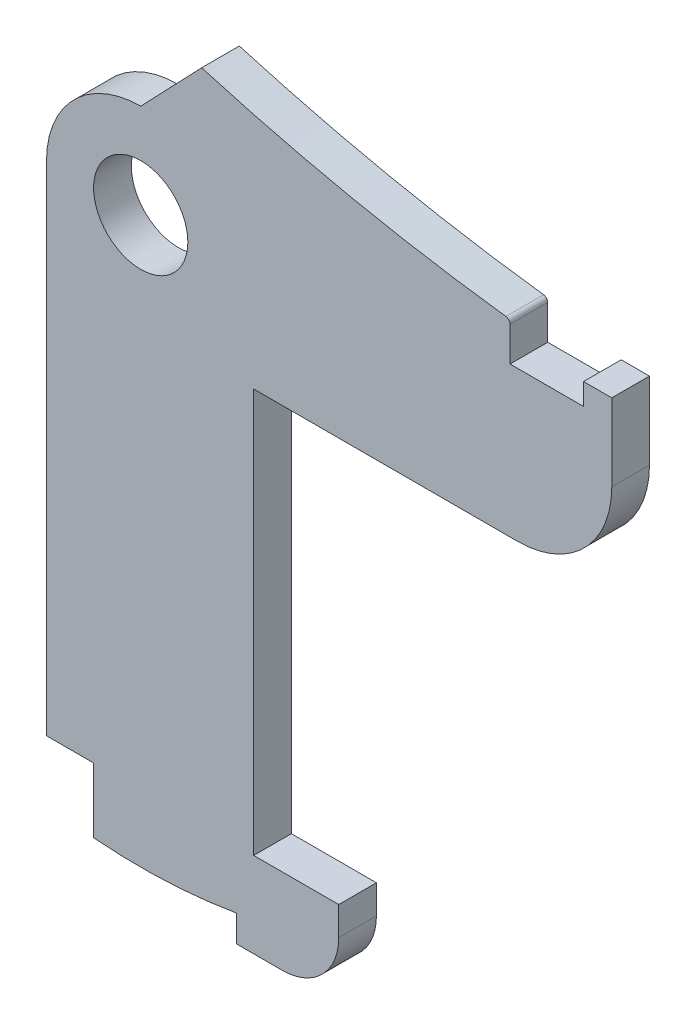
ISO-10303-21;
HEADER;
FILE_DESCRIPTION(('STEP AP214'),'2;1');
FILE_NAME('part.step','',(''),(''),'','','');
FILE_SCHEMA(('AUTOMOTIVE_DESIGN { 1 0 10303 214 1 1 1 1 }'));
ENDSEC;
DATA;
#1=APPLICATION_CONTEXT('core data for automotive mechanical design processes');
#2=APPLICATION_PROTOCOL_DEFINITION('international standard','automotive_design',2000,#1);
#3=PRODUCT_CONTEXT('',#1,'mechanical');
#4=PRODUCT('Part','Part','',(#3));
#5=PRODUCT_RELATED_PRODUCT_CATEGORY('part','',(#4));
#6=PRODUCT_DEFINITION_FORMATION('','',#4);
#7=PRODUCT_DEFINITION_CONTEXT('part definition',#1,'design');
#8=PRODUCT_DEFINITION('design','',#6,#7);
#9=PRODUCT_DEFINITION_SHAPE('','',#8);
#10=(LENGTH_UNIT() NAMED_UNIT(*) SI_UNIT(.MILLI.,.METRE.));
#11=(NAMED_UNIT(*) PLANE_ANGLE_UNIT() SI_UNIT($,.RADIAN.));
#12=(NAMED_UNIT(*) SI_UNIT($,.STERADIAN.) SOLID_ANGLE_UNIT());
#13=UNCERTAINTY_MEASURE_WITH_UNIT(LENGTH_MEASURE(1.E-05),#10,'distance_accuracy_value','');
#14=(GEOMETRIC_REPRESENTATION_CONTEXT(3) GLOBAL_UNCERTAINTY_ASSIGNED_CONTEXT((#13)) GLOBAL_UNIT_ASSIGNED_CONTEXT((#10,
#11,#12)) REPRESENTATION_CONTEXT('',''));
#15=CARTESIAN_POINT('',(0.,0.,0.));
#16=DIRECTION('',(0.,0.,1.));
#17=DIRECTION('',(1.,0.,0.));
#18=AXIS2_PLACEMENT_3D('',#15,#16,#17);
#19=CARTESIAN_POINT('',(37.6551533401373,-13.2873216735918,2.));
#20=DIRECTION('',(0.,0.,-1.));
#21=DIRECTION('',(-1.,0.,0.));
#22=AXIS2_PLACEMENT_3D('',#19,#20,#21);
#23=CYLINDRICAL_SURFACE('',#22,5.);
#24=CARTESIAN_POINT('',(37.6551533401373,-13.2873216735918,0.));
#25=DIRECTION('',(0.,0.,1.));
#26=DIRECTION('',(1.,0.,0.));
#27=AXIS2_PLACEMENT_3D('',#24,#25,#26);
#28=CIRCLE('',#27,5.);
#29=CARTESIAN_POINT('',(42.6551533401373,-13.2873216735918,0.));
#30=VERTEX_POINT('',#29);
#31=CARTESIAN_POINT('',(37.6551533401373,-18.2873216735918,0.));
#32=VERTEX_POINT('',#31);
#33=EDGE_CURVE('E209',#30,#32,#28,.F.);
#34=ORIENTED_EDGE('',*,*,#33,.F.);
#35=DIRECTION('',(0.,0.,-1.));
#36=VECTOR('',#35,1.);
#37=CARTESIAN_POINT('',(42.6551533401373,-13.2873216735918,2.));
#38=LINE('',#37,#36);
#39=CARTESIAN_POINT('',(42.6551533401373,-13.2873216735918,2.));
#40=VERTEX_POINT('',#39);
#41=EDGE_CURVE('E11',#40,#30,#38,.T.);
#42=ORIENTED_EDGE('',*,*,#41,.F.);
#43=CARTESIAN_POINT('',(37.6551533401373,-13.2873216735918,2.));
#44=DIRECTION('',(0.,0.,1.));
#45=DIRECTION('',(1.,0.,0.));
#46=AXIS2_PLACEMENT_3D('',#43,#44,#45);
#47=CIRCLE('',#46,5.);
#48=CARTESIAN_POINT('',(37.6551533401373,-18.2873216735918,2.));
#49=VERTEX_POINT('',#48);
#50=EDGE_CURVE('E266',#40,#49,#47,.F.);
#51=ORIENTED_EDGE('',*,*,#50,.T.);
#52=DIRECTION('',(0.,0.,-1.));
#53=VECTOR('',#52,1.);
#54=CARTESIAN_POINT('',(37.6551533401373,-18.2873216735918,2.));
#55=LINE('',#54,#53);
#56=EDGE_CURVE('E50',#49,#32,#55,.T.);
#57=ORIENTED_EDGE('',*,*,#56,.T.);
#58=EDGE_LOOP('',(#34,#42,#51,#57));
#59=FACE_BOUND('',#58,.T.);
#60=ADVANCED_FACE('F34',(#59),#23,.T.);
#61=CARTESIAN_POINT('',(42.6551533401373,0.,2.));
#62=DIRECTION('',(1.,0.,0.));
#63=DIRECTION('',(0.,0.,-1.));
#64=AXIS2_PLACEMENT_3D('',#61,#62,#63);
#65=PLANE('',#64);
#66=DIRECTION('',(0.,-1.,0.));
#67=VECTOR('',#66,1.);
#68=CARTESIAN_POINT('',(42.6551533401373,0.,0.));
#69=LINE('',#68,#67);
#70=CARTESIAN_POINT('',(42.6551533401373,-9.19140508374461,0.));
#71=VERTEX_POINT('',#70);
#72=EDGE_CURVE('E211',#71,#30,#69,.T.);
#73=ORIENTED_EDGE('',*,*,#72,.F.);
#74=DIRECTION('',(0.,0.,-1.));
#75=VECTOR('',#74,1.);
#76=CARTESIAN_POINT('',(42.6551533401373,-9.19140508374461,2.));
#77=LINE('',#76,#75);
#78=CARTESIAN_POINT('',(42.6551533401373,-9.19140508374461,2.));
#79=VERTEX_POINT('',#78);
#80=EDGE_CURVE('E42',#79,#71,#77,.T.);
#81=ORIENTED_EDGE('',*,*,#80,.F.);
#82=DIRECTION('',(0.,-1.,0.));
#83=VECTOR('',#82,1.);
#84=CARTESIAN_POINT('',(42.6551533401373,0.,2.));
#85=LINE('',#84,#83);
#86=EDGE_CURVE('E326',#79,#40,#85,.T.);
#87=ORIENTED_EDGE('',*,*,#86,.T.);
#88=ORIENTED_EDGE('',*,*,#41,.T.);
#89=EDGE_LOOP('',(#73,#81,#87,#88));
#90=FACE_BOUND('',#89,.T.);
#91=ADVANCED_FACE('F313',(#90),#65,.T.);
#92=CARTESIAN_POINT('',(0.,-9.19140508374461,2.));
#93=DIRECTION('',(0.,1.,0.));
#94=DIRECTION('',(0.,0.,1.));
#95=AXIS2_PLACEMENT_3D('',#92,#93,#94);
#96=PLANE('',#95);
#97=DIRECTION('',(1.,0.,0.));
#98=VECTOR('',#97,1.);
#99=CARTESIAN_POINT('',(0.,-9.19140508374461,0.));
#100=LINE('',#99,#98);
#101=CARTESIAN_POINT('',(41.1551533401373,-9.19140508374461,0.));
#102=VERTEX_POINT('',#101);
#103=EDGE_CURVE('E214',#102,#71,#100,.T.);
#104=ORIENTED_EDGE('',*,*,#103,.F.);
#105=DIRECTION('',(0.,0.,-1.));
#106=VECTOR('',#105,1.);
#107=CARTESIAN_POINT('',(41.1551533401373,-9.19140508374461,2.));
#108=LINE('',#107,#106);
#109=CARTESIAN_POINT('',(41.1551533401373,-9.19140508374461,2.));
#110=VERTEX_POINT('',#109);
#111=EDGE_CURVE('E302',#110,#102,#108,.T.);
#112=ORIENTED_EDGE('',*,*,#111,.F.);
#113=DIRECTION('',(1.,0.,0.));
#114=VECTOR('',#113,1.);
#115=CARTESIAN_POINT('',(0.,-9.19140508374461,2.));
#116=LINE('',#115,#114);
#117=EDGE_CURVE('E309',#110,#79,#116,.T.);
#118=ORIENTED_EDGE('',*,*,#117,.T.);
#119=ORIENTED_EDGE('',*,*,#80,.T.);
#120=EDGE_LOOP('',(#104,#112,#118,#119));
#121=FACE_BOUND('',#120,.T.);
#122=ADVANCED_FACE('F307',(#121),#96,.T.);
#123=CARTESIAN_POINT('',(41.1551533401373,0.,2.));
#124=DIRECTION('',(-1.,0.,0.));
#125=DIRECTION('',(0.,0.,1.));
#126=AXIS2_PLACEMENT_3D('',#123,#124,#125);
#127=PLANE('',#126);
#128=DIRECTION('',(0.,1.,0.));
#129=VECTOR('',#128,1.);
#130=CARTESIAN_POINT('',(41.1551533401373,0.,0.));
#131=LINE('',#130,#129);
#132=CARTESIAN_POINT('',(41.1551533401373,-10.3365932084194,0.));
#133=VERTEX_POINT('',#132);
#134=EDGE_CURVE('E217',#133,#102,#131,.T.);
#135=ORIENTED_EDGE('',*,*,#134,.F.);
#136=DIRECTION('',(0.,0.,-1.));
#137=VECTOR('',#136,1.);
#138=CARTESIAN_POINT('',(41.1551533401373,-10.3365932084194,2.));
#139=LINE('',#138,#137);
#140=CARTESIAN_POINT('',(41.1551533401373,-10.3365932084194,2.));
#141=VERTEX_POINT('',#140);
#142=EDGE_CURVE('E300',#141,#133,#139,.T.);
#143=ORIENTED_EDGE('',*,*,#142,.F.);
#144=DIRECTION('',(0.,1.,0.));
#145=VECTOR('',#144,1.);
#146=CARTESIAN_POINT('',(41.1551533401373,0.,2.));
#147=LINE('',#146,#145);
#148=EDGE_CURVE('E323',#141,#110,#147,.T.);
#149=ORIENTED_EDGE('',*,*,#148,.T.);
#150=ORIENTED_EDGE('',*,*,#111,.T.);
#151=EDGE_LOOP('',(#135,#143,#149,#150));
#152=FACE_BOUND('',#151,.T.);
#153=ADVANCED_FACE('F320',(#152),#127,.T.);
#154=CARTESIAN_POINT('',(0.,-10.3365932084194,2.));
#155=DIRECTION('',(0.,1.,0.));
#156=DIRECTION('',(0.,0.,1.));
#157=AXIS2_PLACEMENT_3D('',#154,#155,#156);
#158=PLANE('',#157);
#159=DIRECTION('',(1.,0.,0.));
#160=VECTOR('',#159,1.);
#161=CARTESIAN_POINT('',(0.,-10.3365932084194,0.));
#162=LINE('',#161,#160);
#163=CARTESIAN_POINT('',(37.2551533401373,-10.3365932084194,0.));
#164=VERTEX_POINT('',#163);
#165=EDGE_CURVE('E220',#164,#133,#162,.T.);
#166=ORIENTED_EDGE('',*,*,#165,.F.);
#167=DIRECTION('',(0.,0.,-1.));
#168=VECTOR('',#167,1.);
#169=CARTESIAN_POINT('',(37.2551533401373,-10.3365932084194,2.));
#170=LINE('',#169,#168);
#171=CARTESIAN_POINT('',(37.2551533401373,-10.3365932084194,2.));
#172=VERTEX_POINT('',#171);
#173=EDGE_CURVE('E298',#172,#164,#170,.T.);
#174=ORIENTED_EDGE('',*,*,#173,.F.);
#175=DIRECTION('',(1.,0.,0.));
#176=VECTOR('',#175,1.);
#177=CARTESIAN_POINT('',(0.,-10.3365932084194,2.));
#178=LINE('',#177,#176);
#179=EDGE_CURVE('E328',#172,#141,#178,.T.);
#180=ORIENTED_EDGE('',*,*,#179,.T.);
#181=ORIENTED_EDGE('',*,*,#142,.T.);
#182=EDGE_LOOP('',(#166,#174,#180,#181));
#183=FACE_BOUND('',#182,.T.);
#184=ADVANCED_FACE('F395',(#183),#158,.T.);
#185=CARTESIAN_POINT('',(37.2551533401373,0.,2.));
#186=DIRECTION('',(1.,0.,0.));
#187=DIRECTION('',(0.,0.,-1.));
#188=AXIS2_PLACEMENT_3D('',#185,#186,#187);
#189=PLANE('',#188);
#190=DIRECTION('',(0.,-1.,0.));
#191=VECTOR('',#190,1.);
#192=CARTESIAN_POINT('',(37.2551533401373,0.,0.));
#193=LINE('',#192,#191);
#194=CARTESIAN_POINT('',(37.2551533401373,-8.50812600454305,0.));
#195=VERTEX_POINT('',#194);
#196=EDGE_CURVE('E223',#195,#164,#193,.T.);
#197=ORIENTED_EDGE('',*,*,#196,.F.);
#198=DIRECTION('',(0.,0.,-1.));
#199=VECTOR('',#198,1.);
#200=CARTESIAN_POINT('',(37.2551533401373,-8.50812600454305,2.));
#201=LINE('',#200,#199);
#202=CARTESIAN_POINT('',(37.2551533401373,-8.50812600454305,2.));
#203=VERTEX_POINT('',#202);
#204=EDGE_CURVE('E296',#203,#195,#201,.T.);
#205=ORIENTED_EDGE('',*,*,#204,.F.);
#206=DIRECTION('',(0.,-1.,0.));
#207=VECTOR('',#206,1.);
#208=CARTESIAN_POINT('',(37.2551533401373,0.,2.));
#209=LINE('',#208,#207);
#210=EDGE_CURVE('E334',#203,#172,#209,.T.);
#211=ORIENTED_EDGE('',*,*,#210,.T.);
#212=ORIENTED_EDGE('',*,*,#173,.T.);
#213=EDGE_LOOP('',(#197,#205,#211,#212));
#214=FACE_BOUND('',#213,.T.);
#215=ADVANCED_FACE('F398',(#214),#189,.T.);
#216=CARTESIAN_POINT('',(37.0051533401373,-8.50812600454305,2.));
#217=DIRECTION('',(0.,0.,-1.));
#218=DIRECTION('',(-1.,0.,0.));
#219=AXIS2_PLACEMENT_3D('',#216,#217,#218);
#220=CYLINDRICAL_SURFACE('',#219,0.250000000000006);
#221=CARTESIAN_POINT('',(37.0051533401373,-8.50812600454305,0.));
#222=DIRECTION('',(0.,0.,1.));
#223=DIRECTION('',(1.,0.,0.));
#224=AXIS2_PLACEMENT_3D('',#221,#222,#223);
#225=CIRCLE('',#224,0.250000000000006);
#226=CARTESIAN_POINT('',(37.0363055040114,-8.26007451253793,0.));
#227=VERTEX_POINT('',#226);
#228=EDGE_CURVE('E226',#227,#195,#225,.F.);
#229=ORIENTED_EDGE('',*,*,#228,.F.);
#230=DIRECTION('',(0.,0.,-1.));
#231=VECTOR('',#230,1.);
#232=CARTESIAN_POINT('',(37.0363055040114,-8.26007451253793,2.));
#233=LINE('',#232,#231);
#234=CARTESIAN_POINT('',(37.0363055040114,-8.26007451253793,2.));
#235=VERTEX_POINT('',#234);
#236=EDGE_CURVE('E294',#235,#227,#233,.T.);
#237=ORIENTED_EDGE('',*,*,#236,.F.);
#238=CARTESIAN_POINT('',(37.0051533401373,-8.50812600454305,2.));
#239=DIRECTION('',(0.,0.,1.));
#240=DIRECTION('',(1.,0.,0.));
#241=AXIS2_PLACEMENT_3D('',#238,#239,#240);
#242=CIRCLE('',#241,0.250000000000006);
#243=EDGE_CURVE('E337',#235,#203,#242,.F.);
#244=ORIENTED_EDGE('',*,*,#243,.T.);
#245=ORIENTED_EDGE('',*,*,#204,.T.);
#246=EDGE_LOOP('',(#229,#237,#244,#245));
#247=FACE_BOUND('',#246,.T.);
#248=ADVANCED_FACE('F402',(#247),#220,.T.);
#249=CARTESIAN_POINT('',(49.9016252193587,94.1810195769606,2.));
#250=DIRECTION('',(0.,0.,-1.));
#251=DIRECTION('',(-1.,0.,0.));
#252=AXIS2_PLACEMENT_3D('',#249,#250,#251);
#253=CYLINDRICAL_SURFACE('',#252,103.245795118405);
#254=CARTESIAN_POINT('',(49.9016252193587,94.1810195769606,0.));
#255=DIRECTION('',(0.,0.,1.));
#256=DIRECTION('',(1.,0.,0.));
#257=AXIS2_PLACEMENT_3D('',#254,#255,#256);
#258=CIRCLE('',#257,103.245795118405);
#259=CARTESIAN_POINT('',(20.8870655256356,-4.90404254347698,0.));
#260=VERTEX_POINT('',#259);
#261=EDGE_CURVE('E229',#227,#260,#258,.F.);
#262=ORIENTED_EDGE('',*,*,#261,.T.);
#263=DIRECTION('',(0.,0.,-1.));
#264=VECTOR('',#263,1.);
#265=CARTESIAN_POINT('',(20.8870655256356,-4.90404254347698,2.));
#266=LINE('',#265,#264);
#267=CARTESIAN_POINT('',(20.8870655256356,-4.90404254347698,2.));
#268=VERTEX_POINT('',#267);
#269=EDGE_CURVE('E292',#268,#260,#266,.T.);
#270=ORIENTED_EDGE('',*,*,#269,.F.);
#271=CARTESIAN_POINT('',(49.9016252193587,94.1810195769606,2.));
#272=DIRECTION('',(0.,0.,1.));
#273=DIRECTION('',(1.,0.,0.));
#274=AXIS2_PLACEMENT_3D('',#271,#272,#273);
#275=CIRCLE('',#274,103.245795118405);
#276=EDGE_CURVE('E340',#235,#268,#275,.F.);
#277=ORIENTED_EDGE('',*,*,#276,.F.);
#278=ORIENTED_EDGE('',*,*,#236,.T.);
#279=EDGE_LOOP('',(#262,#270,#277,#278));
#280=FACE_BOUND('',#279,.T.);
#281=ADVANCED_FACE('F406',(#280),#253,.F.);
#282=CARTESIAN_POINT('',(13.3706696032515,-12.772469653591,2.));
#283=DIRECTION('',(-0.723097327047915,0.690746158596746,0.));
#284=DIRECTION('',(-0.690746158596746,-0.723097327047915,0.));
#285=AXIS2_PLACEMENT_3D('',#282,#283,#284);
#286=PLANE('',#285);
#287=DIRECTION('',(0.690746158596746,0.723097327047915,0.));
#288=VECTOR('',#287,1.);
#289=CARTESIAN_POINT('',(13.3706696032515,-12.772469653591,0.));
#290=LINE('',#289,#288);
#291=CARTESIAN_POINT('',(17.6551533401373,-8.2873216735918,0.));
#292=VERTEX_POINT('',#291);
#293=EDGE_CURVE('E232',#292,#260,#290,.T.);
#294=ORIENTED_EDGE('',*,*,#293,.F.);
#295=DIRECTION('',(0.,0.,-1.));
#296=VECTOR('',#295,1.);
#297=CARTESIAN_POINT('',(17.6551533401373,-8.2873216735918,2.));
#298=LINE('',#297,#296);
#299=CARTESIAN_POINT('',(17.6551533401373,-8.2873216735918,2.));
#300=VERTEX_POINT('',#299);
#301=EDGE_CURVE('E290',#300,#292,#298,.T.);
#302=ORIENTED_EDGE('',*,*,#301,.F.);
#303=DIRECTION('',(0.690746158596746,0.723097327047915,0.));
#304=VECTOR('',#303,1.);
#305=CARTESIAN_POINT('',(13.3706696032515,-12.772469653591,2.));
#306=LINE('',#305,#304);
#307=EDGE_CURVE('E342',#300,#268,#306,.T.);
#308=ORIENTED_EDGE('',*,*,#307,.T.);
#309=ORIENTED_EDGE('',*,*,#269,.T.);
#310=EDGE_LOOP('',(#294,#302,#308,#309));
#311=FACE_BOUND('',#310,.T.);
#312=ADVANCED_FACE('F410',(#311),#286,.T.);
#313=CARTESIAN_POINT('',(17.6551533401373,-13.2873216735918,2.));
#314=DIRECTION('',(0.,0.,-1.));
#315=DIRECTION('',(-1.,0.,0.));
#316=AXIS2_PLACEMENT_3D('',#313,#314,#315);
#317=CYLINDRICAL_SURFACE('',#316,5.);
#318=CARTESIAN_POINT('',(17.6551533401373,-13.2873216735918,0.));
#319=DIRECTION('',(0.,0.,1.));
#320=DIRECTION('',(1.,0.,0.));
#321=AXIS2_PLACEMENT_3D('',#318,#319,#320);
#322=CIRCLE('',#321,5.);
#323=CARTESIAN_POINT('',(12.6551533401373,-13.2873216735918,0.));
#324=VERTEX_POINT('',#323);
#325=EDGE_CURVE('E235',#292,#324,#322,.T.);
#326=ORIENTED_EDGE('',*,*,#325,.T.);
#327=DIRECTION('',(0.,0.,-1.));
#328=VECTOR('',#327,1.);
#329=CARTESIAN_POINT('',(12.6551533401373,-13.2873216735918,2.));
#330=LINE('',#329,#328);
#331=CARTESIAN_POINT('',(12.6551533401373,-13.2873216735918,2.));
#332=VERTEX_POINT('',#331);
#333=EDGE_CURVE('E288',#332,#324,#330,.T.);
#334=ORIENTED_EDGE('',*,*,#333,.F.);
#335=CARTESIAN_POINT('',(17.6551533401373,-13.2873216735918,2.));
#336=DIRECTION('',(0.,0.,1.));
#337=DIRECTION('',(1.,0.,0.));
#338=AXIS2_PLACEMENT_3D('',#335,#336,#337);
#339=CIRCLE('',#338,5.);
#340=EDGE_CURVE('E345',#300,#332,#339,.T.);
#341=ORIENTED_EDGE('',*,*,#340,.F.);
#342=ORIENTED_EDGE('',*,*,#301,.T.);
#343=EDGE_LOOP('',(#326,#334,#341,#342));
#344=FACE_BOUND('',#343,.T.);
#345=ADVANCED_FACE('F414',(#344),#317,.T.);
#346=CARTESIAN_POINT('',(12.6551533401373,0.,2.));
#347=DIRECTION('',(-1.,0.,0.));
#348=DIRECTION('',(0.,-1.,0.));
#349=AXIS2_PLACEMENT_3D('',#346,#347,#348);
#350=PLANE('',#349);
#351=DIRECTION('',(0.,1.,0.));
#352=VECTOR('',#351,1.);
#353=CARTESIAN_POINT('',(12.6551533401373,0.,0.));
#354=LINE('',#353,#352);
#355=CARTESIAN_POINT('',(12.6551533401373,-39.7249994987501,0.));
#356=VERTEX_POINT('',#355);
#357=EDGE_CURVE('E238',#356,#324,#354,.T.);
#358=ORIENTED_EDGE('',*,*,#357,.F.);
#359=DIRECTION('',(0.,0.,-1.));
#360=VECTOR('',#359,1.);
#361=CARTESIAN_POINT('',(12.6551533401373,-39.7249994987501,2.));
#362=LINE('',#361,#360);
#363=CARTESIAN_POINT('',(12.6551533401373,-39.7249994987501,2.));
#364=VERTEX_POINT('',#363);
#365=EDGE_CURVE('E286',#364,#356,#362,.T.);
#366=ORIENTED_EDGE('',*,*,#365,.F.);
#367=DIRECTION('',(0.,1.,0.));
#368=VECTOR('',#367,1.);
#369=CARTESIAN_POINT('',(12.6551533401373,0.,2.));
#370=LINE('',#369,#368);
#371=EDGE_CURVE('E347',#364,#332,#370,.T.);
#372=ORIENTED_EDGE('',*,*,#371,.T.);
#373=ORIENTED_EDGE('',*,*,#333,.T.);
#374=EDGE_LOOP('',(#358,#366,#372,#373));
#375=FACE_BOUND('',#374,.T.);
#376=ADVANCED_FACE('F418',(#375),#350,.T.);
#377=CARTESIAN_POINT('',(0.,-39.7249994987501,2.));
#378=DIRECTION('',(0.,-1.,0.));
#379=DIRECTION('',(0.,0.,-1.));
#380=AXIS2_PLACEMENT_3D('',#377,#378,#379);
#381=PLANE('',#380);
#382=DIRECTION('',(-1.,0.,0.));
#383=VECTOR('',#382,1.);
#384=CARTESIAN_POINT('',(0.,-39.7249994987501,0.));
#385=LINE('',#384,#383);
#386=CARTESIAN_POINT('',(15.1551533401373,-39.7249994987501,0.));
#387=VERTEX_POINT('',#386);
#388=EDGE_CURVE('E241',#387,#356,#385,.T.);
#389=ORIENTED_EDGE('',*,*,#388,.F.);
#390=DIRECTION('',(0.,0.,-1.));
#391=VECTOR('',#390,1.);
#392=CARTESIAN_POINT('',(15.1551533401373,-39.7249994987501,2.));
#393=LINE('',#392,#391);
#394=CARTESIAN_POINT('',(15.1551533401373,-39.7249994987501,2.));
#395=VERTEX_POINT('',#394);
#396=EDGE_CURVE('E284',#395,#387,#393,.T.);
#397=ORIENTED_EDGE('',*,*,#396,.F.);
#398=DIRECTION('',(-1.,0.,0.));
#399=VECTOR('',#398,1.);
#400=CARTESIAN_POINT('',(0.,-39.7249994987501,2.));
#401=LINE('',#400,#399);
#402=EDGE_CURVE('E350',#395,#364,#401,.T.);
#403=ORIENTED_EDGE('',*,*,#402,.T.);
#404=ORIENTED_EDGE('',*,*,#365,.T.);
#405=EDGE_LOOP('',(#389,#397,#403,#404));
#406=FACE_BOUND('',#405,.T.);
#407=ADVANCED_FACE('F422',(#406),#381,.T.);
#408=CARTESIAN_POINT('',(15.1551533401373,0.,2.));
#409=DIRECTION('',(-1.,0.,0.));
#410=DIRECTION('',(0.,0.,1.));
#411=AXIS2_PLACEMENT_3D('',#408,#409,#410);
#412=PLANE('',#411);
#413=DIRECTION('',(0.,1.,0.));
#414=VECTOR('',#413,1.);
#415=CARTESIAN_POINT('',(15.1551533401373,0.,0.));
#416=LINE('',#415,#414);
#417=CARTESIAN_POINT('',(15.1551533401373,-43.1617960065011,0.));
#418=VERTEX_POINT('',#417);
#419=EDGE_CURVE('E244',#418,#387,#416,.T.);
#420=ORIENTED_EDGE('',*,*,#419,.F.);
#421=DIRECTION('',(0.,0.,-1.));
#422=VECTOR('',#421,1.);
#423=CARTESIAN_POINT('',(15.1551533401373,-43.1617960065011,2.));
#424=LINE('',#423,#422);
#425=CARTESIAN_POINT('',(15.1551533401373,-43.1617960065011,2.));
#426=VERTEX_POINT('',#425);
#427=EDGE_CURVE('E282',#426,#418,#424,.T.);
#428=ORIENTED_EDGE('',*,*,#427,.F.);
#429=DIRECTION('',(0.,1.,0.));
#430=VECTOR('',#429,1.);
#431=CARTESIAN_POINT('',(15.1551533401373,0.,2.));
#432=LINE('',#431,#430);
#433=EDGE_CURVE('E353',#426,#395,#432,.T.);
#434=ORIENTED_EDGE('',*,*,#433,.T.);
#435=ORIENTED_EDGE('',*,*,#396,.T.);
#436=EDGE_LOOP('',(#420,#428,#434,#435));
#437=FACE_BOUND('',#436,.T.);
#438=ADVANCED_FACE('F426',(#437),#412,.T.);
#439=CARTESIAN_POINT('',(17.6551533401373,-13.2873216735918,2.));
#440=DIRECTION('',(0.,0.,-1.));
#441=DIRECTION('',(-1.,0.,0.));
#442=AXIS2_PLACEMENT_3D('',#439,#440,#441);
#443=CYLINDRICAL_SURFACE('',#442,29.9788961882798);
#444=CARTESIAN_POINT('',(17.6551533401373,-13.2873216735918,0.));
#445=DIRECTION('',(0.,0.,1.));
#446=DIRECTION('',(1.,0.,0.));
#447=AXIS2_PLACEMENT_3D('',#444,#445,#446);
#448=CIRCLE('',#447,29.9788961882798);
#449=CARTESIAN_POINT('',(22.731294665656,-42.8333367333425,0.));
#450=VERTEX_POINT('',#449);
#451=EDGE_CURVE('E247',#418,#450,#448,.T.);
#452=ORIENTED_EDGE('',*,*,#451,.T.);
#453=DIRECTION('',(0.,0.,-1.));
#454=VECTOR('',#453,1.);
#455=CARTESIAN_POINT('',(22.731294665656,-42.8333367333425,2.));
#456=LINE('',#455,#454);
#457=CARTESIAN_POINT('',(22.731294665656,-42.8333367333425,2.));
#458=VERTEX_POINT('',#457);
#459=EDGE_CURVE('E279',#458,#450,#456,.T.);
#460=ORIENTED_EDGE('',*,*,#459,.F.);
#461=CARTESIAN_POINT('',(17.6551533401373,-13.2873216735918,2.));
#462=DIRECTION('',(0.,0.,1.));
#463=DIRECTION('',(1.,0.,0.));
#464=AXIS2_PLACEMENT_3D('',#461,#462,#463);
#465=CIRCLE('',#464,29.9788961882798);
#466=EDGE_CURVE('E356',#426,#458,#465,.T.);
#467=ORIENTED_EDGE('',*,*,#466,.F.);
#468=ORIENTED_EDGE('',*,*,#427,.T.);
#469=EDGE_LOOP('',(#452,#460,#467,#468));
#470=FACE_BOUND('',#469,.T.);
#471=ADVANCED_FACE('F430',(#470),#443,.T.);
#472=CARTESIAN_POINT('',(22.731294665656,0.,2.));
#473=DIRECTION('',(1.,0.,0.));
#474=DIRECTION('',(0.,0.,-1.));
#475=AXIS2_PLACEMENT_3D('',#472,#473,#474);
#476=PLANE('',#475);
#477=DIRECTION('',(0.,-1.,0.));
#478=VECTOR('',#477,1.);
#479=CARTESIAN_POINT('',(22.731294665656,0.,0.));
#480=LINE('',#479,#478);
#481=CARTESIAN_POINT('',(22.731294665656,-44.2490790535218,0.));
#482=VERTEX_POINT('',#481);
#483=EDGE_CURVE('E249',#450,#482,#480,.T.);
#484=ORIENTED_EDGE('',*,*,#483,.T.);
#485=DIRECTION('',(0.,0.,-1.));
#486=VECTOR('',#485,1.);
#487=CARTESIAN_POINT('',(22.731294665656,-44.2490790535218,2.));
#488=LINE('',#487,#486);
#489=CARTESIAN_POINT('',(22.731294665656,-44.2490790535218,2.));
#490=VERTEX_POINT('',#489);
#491=EDGE_CURVE('E276',#490,#482,#488,.T.);
#492=ORIENTED_EDGE('',*,*,#491,.F.);
#493=DIRECTION('',(0.,-1.,0.));
#494=VECTOR('',#493,1.);
#495=CARTESIAN_POINT('',(22.731294665656,0.,2.));
#496=LINE('',#495,#494);
#497=EDGE_CURVE('E358',#458,#490,#496,.T.);
#498=ORIENTED_EDGE('',*,*,#497,.F.);
#499=ORIENTED_EDGE('',*,*,#459,.T.);
#500=EDGE_LOOP('',(#484,#492,#498,#499));
#501=FACE_BOUND('',#500,.T.);
#502=ADVANCED_FACE('F434',(#501),#476,.F.);
#503=CARTESIAN_POINT('',(0.,-44.2490790535218,2.));
#504=DIRECTION('',(0.,1.,0.));
#505=DIRECTION('',(0.,0.,1.));
#506=AXIS2_PLACEMENT_3D('',#503,#504,#505);
#507=PLANE('',#506);
#508=DIRECTION('',(1.,0.,0.));
#509=VECTOR('',#508,1.);
#510=CARTESIAN_POINT('',(0.,-44.2490790535218,0.));
#511=LINE('',#510,#509);
#512=CARTESIAN_POINT('',(25.1634057429237,-44.2490790535218,0.));
#513=VERTEX_POINT('',#512);
#514=EDGE_CURVE('E251',#482,#513,#511,.T.);
#515=ORIENTED_EDGE('',*,*,#514,.T.);
#516=DIRECTION('',(0.,0.,-1.));
#517=VECTOR('',#516,1.);
#518=CARTESIAN_POINT('',(25.1634057429237,-44.2490790535218,2.));
#519=LINE('',#518,#517);
#520=CARTESIAN_POINT('',(25.1634057429237,-44.2490790535218,2.));
#521=VERTEX_POINT('',#520);
#522=EDGE_CURVE('E273',#521,#513,#519,.T.);
#523=ORIENTED_EDGE('',*,*,#522,.F.);
#524=DIRECTION('',(1.,0.,0.));
#525=VECTOR('',#524,1.);
#526=CARTESIAN_POINT('',(0.,-44.2490790535218,2.));
#527=LINE('',#526,#525);
#528=EDGE_CURVE('E360',#490,#521,#527,.T.);
#529=ORIENTED_EDGE('',*,*,#528,.F.);
#530=ORIENTED_EDGE('',*,*,#491,.T.);
#531=EDGE_LOOP('',(#515,#523,#529,#530));
#532=FACE_BOUND('',#531,.T.);
#533=ADVANCED_FACE('F438',(#532),#507,.F.);
#534=CARTESIAN_POINT('',(25.1634057429237,-41.2490790535218,2.));
#535=DIRECTION('',(0.,0.,-1.));
#536=DIRECTION('',(-1.,0.,0.));
#537=AXIS2_PLACEMENT_3D('',#534,#535,#536);
#538=CYLINDRICAL_SURFACE('',#537,3.);
#539=CARTESIAN_POINT('',(25.1634057429237,-41.2490790535218,0.));
#540=DIRECTION('',(0.,0.,1.));
#541=DIRECTION('',(1.,0.,0.));
#542=AXIS2_PLACEMENT_3D('',#539,#540,#541);
#543=CIRCLE('',#542,3.);
#544=CARTESIAN_POINT('',(28.1634057429237,-41.2490790535218,0.));
#545=VERTEX_POINT('',#544);
#546=EDGE_CURVE('E253',#513,#545,#543,.T.);
#547=ORIENTED_EDGE('',*,*,#546,.T.);
#548=DIRECTION('',(0.,0.,-1.));
#549=VECTOR('',#548,1.);
#550=CARTESIAN_POINT('',(28.1634057429237,-41.2490790535218,2.));
#551=LINE('',#550,#549);
#552=CARTESIAN_POINT('',(28.1634057429237,-41.2490790535218,2.));
#553=VERTEX_POINT('',#552);
#554=EDGE_CURVE('E270',#553,#545,#551,.T.);
#555=ORIENTED_EDGE('',*,*,#554,.F.);
#556=CARTESIAN_POINT('',(25.1634057429237,-41.2490790535218,2.));
#557=DIRECTION('',(0.,0.,1.));
#558=DIRECTION('',(1.,0.,0.));
#559=AXIS2_PLACEMENT_3D('',#556,#557,#558);
#560=CIRCLE('',#559,3.);
#561=EDGE_CURVE('E362',#521,#553,#560,.T.);
#562=ORIENTED_EDGE('',*,*,#561,.F.);
#563=ORIENTED_EDGE('',*,*,#522,.T.);
#564=EDGE_LOOP('',(#547,#555,#562,#563));
#565=FACE_BOUND('',#564,.T.);
#566=ADVANCED_FACE('F368',(#565),#538,.T.);
#567=CARTESIAN_POINT('',(28.1634057429237,0.,2.));
#568=DIRECTION('',(-1.,0.,0.));
#569=DIRECTION('',(0.,0.,1.));
#570=AXIS2_PLACEMENT_3D('',#567,#568,#569);
#571=PLANE('',#570);
#572=DIRECTION('',(0.,1.,0.));
#573=VECTOR('',#572,1.);
#574=CARTESIAN_POINT('',(28.1634057429237,0.,0.));
#575=LINE('',#574,#573);
#576=CARTESIAN_POINT('',(28.1634057429237,-39.7249994987501,0.));
#577=VERTEX_POINT('',#576);
#578=EDGE_CURVE('E255',#545,#577,#575,.T.);
#579=ORIENTED_EDGE('',*,*,#578,.T.);
#580=DIRECTION('',(0.,0.,-1.));
#581=VECTOR('',#580,1.);
#582=CARTESIAN_POINT('',(28.1634057429237,-39.7249994987501,2.));
#583=LINE('',#582,#581);
#584=CARTESIAN_POINT('',(28.1634057429237,-39.7249994987501,2.));
#585=VERTEX_POINT('',#584);
#586=EDGE_CURVE('E198',#585,#577,#583,.T.);
#587=ORIENTED_EDGE('',*,*,#586,.F.);
#588=DIRECTION('',(0.,1.,0.));
#589=VECTOR('',#588,1.);
#590=CARTESIAN_POINT('',(28.1634057429237,0.,2.));
#591=LINE('',#590,#589);
#592=EDGE_CURVE('E186',#553,#585,#591,.T.);
#593=ORIENTED_EDGE('',*,*,#592,.F.);
#594=ORIENTED_EDGE('',*,*,#554,.T.);
#595=EDGE_LOOP('',(#579,#587,#593,#594));
#596=FACE_BOUND('',#595,.T.);
#597=ADVANCED_FACE('F372',(#596),#571,.F.);
#598=CARTESIAN_POINT('',(0.,-39.7249994987501,2.));
#599=DIRECTION('',(0.,-1.,0.));
#600=DIRECTION('',(0.,0.,-1.));
#601=AXIS2_PLACEMENT_3D('',#598,#599,#600);
#602=PLANE('',#601);
#603=DIRECTION('',(-1.,0.,0.));
#604=VECTOR('',#603,1.);
#605=CARTESIAN_POINT('',(0.,-39.7249994987501,0.));
#606=LINE('',#605,#604);
#607=CARTESIAN_POINT('',(23.6500222638875,-39.7249994987501,0.));
#608=VERTEX_POINT('',#607);
#609=EDGE_CURVE('E195',#577,#608,#606,.T.);
#610=ORIENTED_EDGE('',*,*,#609,.T.);
#611=DIRECTION('',(0.,0.,-1.));
#612=VECTOR('',#611,1.);
#613=CARTESIAN_POINT('',(23.6500222638875,-39.7249994987501,2.));
#614=LINE('',#613,#612);
#615=CARTESIAN_POINT('',(23.6500222638875,-39.7249994987501,2.));
#616=VERTEX_POINT('',#615);
#617=EDGE_CURVE('E192',#616,#608,#614,.T.);
#618=ORIENTED_EDGE('',*,*,#617,.F.);
#619=DIRECTION('',(-1.,0.,0.));
#620=VECTOR('',#619,1.);
#621=CARTESIAN_POINT('',(0.,-39.7249994987501,2.));
#622=LINE('',#621,#620);
#623=EDGE_CURVE('E178',#585,#616,#622,.T.);
#624=ORIENTED_EDGE('',*,*,#623,.F.);
#625=ORIENTED_EDGE('',*,*,#586,.T.);
#626=EDGE_LOOP('',(#610,#618,#624,#625));
#627=FACE_BOUND('',#626,.T.);
#628=ADVANCED_FACE('F193',(#627),#602,.F.);
#629=CARTESIAN_POINT('',(23.6500222638874,0.,2.));
#630=DIRECTION('',(1.,0.,0.));
#631=DIRECTION('',(0.,1.,0.));
#632=AXIS2_PLACEMENT_3D('',#629,#630,#631);
#633=PLANE('',#632);
#634=DIRECTION('',(0.,-1.,0.));
#635=VECTOR('',#634,1.);
#636=CARTESIAN_POINT('',(23.6500222638874,0.,0.));
#637=LINE('',#636,#635);
#638=CARTESIAN_POINT('',(23.6500222638875,-18.2873216735918,0.));
#639=VERTEX_POINT('',#638);
#640=EDGE_CURVE('E258',#639,#608,#637,.T.);
#641=ORIENTED_EDGE('',*,*,#640,.F.);
#642=DIRECTION('',(0.,0.,-1.));
#643=VECTOR('',#642,1.);
#644=CARTESIAN_POINT('',(23.6500222638875,-18.2873216735918,2.));
#645=LINE('',#644,#643);
#646=CARTESIAN_POINT('',(23.6500222638875,-18.2873216735918,2.));
#647=VERTEX_POINT('',#646);
#648=EDGE_CURVE('E114',#647,#639,#645,.T.);
#649=ORIENTED_EDGE('',*,*,#648,.F.);
#650=DIRECTION('',(0.,-1.,0.));
#651=VECTOR('',#650,1.);
#652=CARTESIAN_POINT('',(23.6500222638874,0.,2.));
#653=LINE('',#652,#651);
#654=EDGE_CURVE('E184',#647,#616,#653,.T.);
#655=ORIENTED_EDGE('',*,*,#654,.T.);
#656=ORIENTED_EDGE('',*,*,#617,.T.);
#657=EDGE_LOOP('',(#641,#649,#655,#656));
#658=FACE_BOUND('',#657,.T.);
#659=ADVANCED_FACE('F200',(#658),#633,.T.);
#660=CARTESIAN_POINT('',(0.,-18.2873216735918,2.));
#661=DIRECTION('',(0.,-1.,0.));
#662=DIRECTION('',(0.,0.,-1.));
#663=AXIS2_PLACEMENT_3D('',#660,#661,#662);
#664=PLANE('',#663);
#665=DIRECTION('',(-1.,0.,0.));
#666=VECTOR('',#665,1.);
#667=CARTESIAN_POINT('',(0.,-18.2873216735918,0.));
#668=LINE('',#667,#666);
#669=EDGE_CURVE('E260',#32,#639,#668,.T.);
#670=ORIENTED_EDGE('',*,*,#669,.F.);
#671=ORIENTED_EDGE('',*,*,#56,.F.);
#672=DIRECTION('',(-1.,0.,0.));
#673=VECTOR('',#672,1.);
#674=CARTESIAN_POINT('',(0.,-18.2873216735918,2.));
#675=LINE('',#674,#673);
#676=EDGE_CURVE('E201',#49,#647,#675,.T.);
#677=ORIENTED_EDGE('',*,*,#676,.T.);
#678=ORIENTED_EDGE('',*,*,#648,.T.);
#679=EDGE_LOOP('',(#670,#671,#677,#678));
#680=FACE_BOUND('',#679,.T.);
#681=ADVANCED_FACE('F373',(#680),#664,.T.);
#682=CARTESIAN_POINT('',(17.6551533401373,-13.2873216735918,2.));
#683=DIRECTION('',(0.,0.,-1.));
#684=DIRECTION('',(-1.,0.,0.));
#685=AXIS2_PLACEMENT_3D('',#682,#683,#684);
#686=CYLINDRICAL_SURFACE('',#685,2.5);
#687=CARTESIAN_POINT('',(17.6551533401373,-13.2873216735918,2.));
#688=DIRECTION('',(0.,0.,1.));
#689=DIRECTION('',(1.,0.,0.));
#690=AXIS2_PLACEMENT_3D('',#687,#688,#689);
#691=CIRCLE('',#690,2.5);
#692=CARTESIAN_POINT('',(20.1551533401373,-13.2873216735918,2.));
#693=VERTEX_POINT('',#692);
#694=EDGE_CURVE('E203',#693,#693,#691,.T.);
#695=ORIENTED_EDGE('',*,*,#694,.T.);
#696=EDGE_LOOP('',(#695));
#697=FACE_BOUND('',#696,.T.);
#698=CARTESIAN_POINT('',(17.6551533401373,-13.2873216735918,0.));
#699=DIRECTION('',(0.,0.,1.));
#700=DIRECTION('',(1.,0.,0.));
#701=AXIS2_PLACEMENT_3D('',#698,#699,#700);
#702=CIRCLE('',#701,2.5);
#703=CARTESIAN_POINT('',(20.1551533401373,-13.2873216735918,0.));
#704=VERTEX_POINT('',#703);
#705=EDGE_CURVE('E263',#704,#704,#702,.T.);
#706=ORIENTED_EDGE('',*,*,#705,.F.);
#707=EDGE_LOOP('',(#706));
#708=FACE_BOUND('',#707,.T.);
#709=ADVANCED_FACE('F375',(#697,#708),#686,.F.);
#710=CARTESIAN_POINT('',(0.,0.,2.));
#711=DIRECTION('',(0.,0.,1.));
#712=DIRECTION('',(1.,0.,0.));
#713=AXIS2_PLACEMENT_3D('',#710,#711,#712);
#714=PLANE('',#713);
#715=ORIENTED_EDGE('',*,*,#50,.F.);
#716=ORIENTED_EDGE('',*,*,#86,.F.);
#717=ORIENTED_EDGE('',*,*,#117,.F.);
#718=ORIENTED_EDGE('',*,*,#148,.F.);
#719=ORIENTED_EDGE('',*,*,#179,.F.);
#720=ORIENTED_EDGE('',*,*,#210,.F.);
#721=ORIENTED_EDGE('',*,*,#243,.F.);
#722=ORIENTED_EDGE('',*,*,#276,.T.);
#723=ORIENTED_EDGE('',*,*,#307,.F.);
#724=ORIENTED_EDGE('',*,*,#340,.T.);
#725=ORIENTED_EDGE('',*,*,#371,.F.);
#726=ORIENTED_EDGE('',*,*,#402,.F.);
#727=ORIENTED_EDGE('',*,*,#433,.F.);
#728=ORIENTED_EDGE('',*,*,#466,.T.);
#729=ORIENTED_EDGE('',*,*,#497,.T.);
#730=ORIENTED_EDGE('',*,*,#528,.T.);
#731=ORIENTED_EDGE('',*,*,#561,.T.);
#732=ORIENTED_EDGE('',*,*,#592,.T.);
#733=ORIENTED_EDGE('',*,*,#623,.T.);
#734=ORIENTED_EDGE('',*,*,#654,.F.);
#735=ORIENTED_EDGE('',*,*,#676,.F.);
#736=EDGE_LOOP('',(#715,#716,#717,#718,#719,#720,#721,#722,#723,#724,#725,#726,#727,#728,#729,
#730,#731,#732,#733,#734,#735));
#737=FACE_BOUND('',#736,.T.);
#738=ORIENTED_EDGE('',*,*,#694,.F.);
#739=EDGE_LOOP('',(#738));
#740=FACE_BOUND('',#739,.T.);
#741=ADVANCED_FACE('F180',(#737,#740),#714,.T.);
#742=CARTESIAN_POINT('',(0.,0.,0.));
#743=DIRECTION('',(0.,0.,1.));
#744=DIRECTION('',(1.,0.,0.));
#745=AXIS2_PLACEMENT_3D('',#742,#743,#744);
#746=PLANE('',#745);
#747=ORIENTED_EDGE('',*,*,#33,.T.);
#748=ORIENTED_EDGE('',*,*,#669,.T.);
#749=ORIENTED_EDGE('',*,*,#640,.T.);
#750=ORIENTED_EDGE('',*,*,#609,.F.);
#751=ORIENTED_EDGE('',*,*,#578,.F.);
#752=ORIENTED_EDGE('',*,*,#546,.F.);
#753=ORIENTED_EDGE('',*,*,#514,.F.);
#754=ORIENTED_EDGE('',*,*,#483,.F.);
#755=ORIENTED_EDGE('',*,*,#451,.F.);
#756=ORIENTED_EDGE('',*,*,#419,.T.);
#757=ORIENTED_EDGE('',*,*,#388,.T.);
#758=ORIENTED_EDGE('',*,*,#357,.T.);
#759=ORIENTED_EDGE('',*,*,#325,.F.);
#760=ORIENTED_EDGE('',*,*,#293,.T.);
#761=ORIENTED_EDGE('',*,*,#261,.F.);
#762=ORIENTED_EDGE('',*,*,#228,.T.);
#763=ORIENTED_EDGE('',*,*,#196,.T.);
#764=ORIENTED_EDGE('',*,*,#165,.T.);
#765=ORIENTED_EDGE('',*,*,#134,.T.);
#766=ORIENTED_EDGE('',*,*,#103,.T.);
#767=ORIENTED_EDGE('',*,*,#72,.T.);
#768=EDGE_LOOP('',(#747,#748,#749,#750,#751,#752,#753,#754,#755,#756,#757,#758,#759,#760,#761,
#762,#763,#764,#765,#766,#767));
#769=FACE_BOUND('',#768,.T.);
#770=ORIENTED_EDGE('',*,*,#705,.T.);
#771=EDGE_LOOP('',(#770));
#772=FACE_BOUND('',#771,.T.);
#773=ADVANCED_FACE('F315',(#769,#772),#746,.F.);
#774=CLOSED_SHELL('',(#60,#91,#122,#153,#184,#215,#248,#281,#312,#345,#376,#407,#438,#471,#502,
#533,#566,#597,#628,#659,#681,#709,#741,#773));
#775=MANIFOLD_SOLID_BREP('B2',#774);
#776=ADVANCED_BREP_SHAPE_REPRESENTATION('',(#18,#775),#14);
#777=SHAPE_DEFINITION_REPRESENTATION(#9,#776);
ENDSEC;
END-ISO-10303-21;
